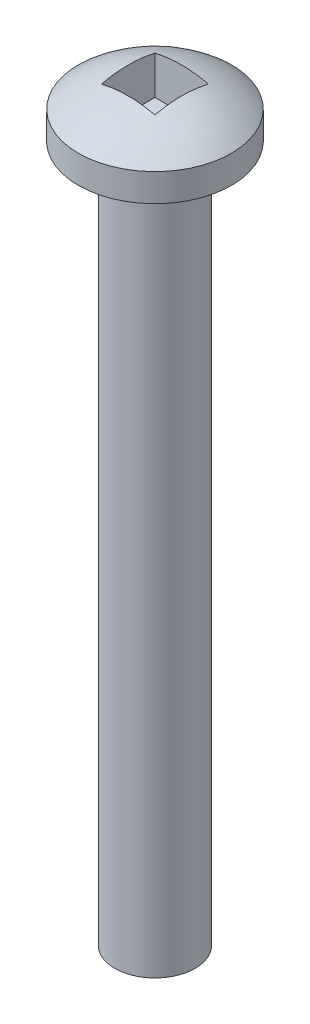
ISO-10303-21;
HEADER;
FILE_DESCRIPTION(('STEP AP214'),'2;1');
FILE_NAME('part.step','',(''),(''),'','','');
FILE_SCHEMA(('AUTOMOTIVE_DESIGN { 1 0 10303 214 1 1 1 1 }'));
ENDSEC;
DATA;
#1=APPLICATION_CONTEXT('core data for automotive mechanical design processes');
#2=APPLICATION_PROTOCOL_DEFINITION('international standard','automotive_design',2000,#1);
#3=PRODUCT_CONTEXT('',#1,'mechanical');
#4=PRODUCT('Part','Part','',(#3));
#5=PRODUCT_RELATED_PRODUCT_CATEGORY('part','',(#4));
#6=PRODUCT_DEFINITION_FORMATION('','',#4);
#7=PRODUCT_DEFINITION_CONTEXT('part definition',#1,'design');
#8=PRODUCT_DEFINITION('design','',#6,#7);
#9=PRODUCT_DEFINITION_SHAPE('','',#8);
#10=(LENGTH_UNIT() NAMED_UNIT(*) SI_UNIT(.MILLI.,.METRE.));
#11=(NAMED_UNIT(*) PLANE_ANGLE_UNIT() SI_UNIT($,.RADIAN.));
#12=(NAMED_UNIT(*) SI_UNIT($,.STERADIAN.) SOLID_ANGLE_UNIT());
#13=UNCERTAINTY_MEASURE_WITH_UNIT(LENGTH_MEASURE(1.E-05),#10,'distance_accuracy_value','');
#14=(GEOMETRIC_REPRESENTATION_CONTEXT(3) GLOBAL_UNCERTAINTY_ASSIGNED_CONTEXT((#13)) GLOBAL_UNIT_ASSIGNED_CONTEXT((#10,
#11,#12)) REPRESENTATION_CONTEXT('',''));
#15=CARTESIAN_POINT('',(0.,0.,0.));
#16=DIRECTION('',(0.,0.,1.));
#17=DIRECTION('',(1.,0.,0.));
#18=AXIS2_PLACEMENT_3D('',#15,#16,#17);
#19=CARTESIAN_POINT('',(0.,-31.75,0.));
#20=DIRECTION('',(0.,1.,0.));
#21=DIRECTION('',(0.,0.,1.));
#22=AXIS2_PLACEMENT_3D('',#19,#20,#21);
#23=CYLINDRICAL_SURFACE('',#22,1.8288);
#24=CARTESIAN_POINT('',(0.,-31.75,0.));
#25=DIRECTION('',(0.,1.,0.));
#26=DIRECTION('',(0.,0.,1.));
#27=AXIS2_PLACEMENT_3D('',#24,#25,#26);
#28=CIRCLE('',#27,1.8288);
#29=CARTESIAN_POINT('',(0.,-31.75,1.8288));
#30=VERTEX_POINT('',#29);
#31=EDGE_CURVE('E104',#30,#30,#28,.T.);
#32=ORIENTED_EDGE('',*,*,#31,.T.);
#33=EDGE_LOOP('',(#32));
#34=FACE_BOUND('',#33,.T.);
#35=CARTESIAN_POINT('',(0.,0.,0.));
#36=DIRECTION('',(0.,1.,0.));
#37=DIRECTION('',(0.,0.,1.));
#38=AXIS2_PLACEMENT_3D('',#35,#36,#37);
#39=CIRCLE('',#38,1.8288);
#40=CARTESIAN_POINT('',(0.,0.,1.8288));
#41=VERTEX_POINT('',#40);
#42=EDGE_CURVE('E108',#41,#41,#39,.T.);
#43=ORIENTED_EDGE('',*,*,#42,.F.);
#44=EDGE_LOOP('',(#43));
#45=FACE_BOUND('',#44,.T.);
#46=ADVANCED_FACE('F32',(#34,#45),#23,.T.);
#47=CARTESIAN_POINT('',(0.,-31.75,0.));
#48=DIRECTION('',(0.,1.,0.));
#49=DIRECTION('',(0.,0.,1.));
#50=AXIS2_PLACEMENT_3D('',#47,#48,#49);
#51=PLANE('',#50);
#52=ORIENTED_EDGE('',*,*,#31,.F.);
#53=EDGE_LOOP('',(#52));
#54=FACE_BOUND('',#53,.T.);
#55=ADVANCED_FACE('F128',(#54),#51,.F.);
#56=CARTESIAN_POINT('',(0.,1.27,0.));
#57=DIRECTION('',(0.,-1.,0.));
#58=DIRECTION('',(0.,0.,-1.));
#59=AXIS2_PLACEMENT_3D('',#56,#57,#58);
#60=CYLINDRICAL_SURFACE('',#59,3.4925);
#61=CARTESIAN_POINT('',(0.,1.27,0.));
#62=DIRECTION('',(0.,1.,0.));
#63=DIRECTION('',(0.,0.,1.));
#64=AXIS2_PLACEMENT_3D('',#61,#62,#63);
#65=CIRCLE('',#64,3.4925);
#66=CARTESIAN_POINT('',(0.,1.27,3.4925));
#67=VERTEX_POINT('',#66);
#68=EDGE_CURVE('E103',#67,#67,#65,.T.);
#69=ORIENTED_EDGE('',*,*,#68,.F.);
#70=EDGE_LOOP('',(#69));
#71=FACE_BOUND('',#70,.T.);
#72=CARTESIAN_POINT('',(0.,0.,0.));
#73=DIRECTION('',(0.,1.,0.));
#74=DIRECTION('',(0.,0.,1.));
#75=AXIS2_PLACEMENT_3D('',#72,#73,#74);
#76=CIRCLE('',#75,3.4925);
#77=CARTESIAN_POINT('',(0.,0.,3.4925));
#78=VERTEX_POINT('',#77);
#79=EDGE_CURVE('E97',#78,#78,#76,.T.);
#80=ORIENTED_EDGE('',*,*,#79,.T.);
#81=EDGE_LOOP('',(#80));
#82=FACE_BOUND('',#81,.T.);
#83=ADVANCED_FACE('F123',(#71,#82),#60,.T.);
#84=CARTESIAN_POINT('',(0.,-2.8971875,0.));
#85=DIRECTION('',(0.,0.,1.));
#86=DIRECTION('',(1.,0.,0.));
#87=AXIS2_PLACEMENT_3D('',#84,#85,#86);
#88=SPHERICAL_SURFACE('',#87,5.4371875);
#89=CARTESIAN_POINT('',(1.2192,-2.8971875,0.));
#90=DIRECTION('',(1.,0.,0.));
#91=DIRECTION('',(0.,0.,-1.));
#92=AXIS2_PLACEMENT_3D('',#89,#90,#91);
#93=CIRCLE('',#92,5.29873185490229);
#94=CARTESIAN_POINT('',(1.2192,2.25937246088053,1.2192));
#95=VERTEX_POINT('',#94);
#96=CARTESIAN_POINT('',(1.2192,2.25937246088053,-1.2192));
#97=VERTEX_POINT('',#96);
#98=EDGE_CURVE('E11',#95,#97,#93,.F.);
#99=ORIENTED_EDGE('',*,*,#98,.F.);
#100=CARTESIAN_POINT('',(0.,-2.8971875,1.2192));
#101=DIRECTION('',(0.,0.,1.));
#102=DIRECTION('',(1.,0.,0.));
#103=AXIS2_PLACEMENT_3D('',#100,#101,#102);
#104=CIRCLE('',#103,5.29873185490229);
#105=CARTESIAN_POINT('',(-1.2192,2.25937246088053,1.2192));
#106=VERTEX_POINT('',#105);
#107=EDGE_CURVE('E40',#106,#95,#104,.F.);
#108=ORIENTED_EDGE('',*,*,#107,.F.);
#109=CARTESIAN_POINT('',(-1.2192,-2.8971875,0.));
#110=DIRECTION('',(-1.,0.,0.));
#111=DIRECTION('',(0.,0.,1.));
#112=AXIS2_PLACEMENT_3D('',#109,#110,#111);
#113=CIRCLE('',#112,5.29873185490229);
#114=CARTESIAN_POINT('',(-1.2192,2.25937246088053,-1.2192));
#115=VERTEX_POINT('',#114);
#116=EDGE_CURVE('E114',#115,#106,#113,.F.);
#117=ORIENTED_EDGE('',*,*,#116,.F.);
#118=CARTESIAN_POINT('',(0.,-2.8971875,-1.2192));
#119=DIRECTION('',(0.,0.,-1.));
#120=DIRECTION('',(-1.,0.,0.));
#121=AXIS2_PLACEMENT_3D('',#118,#119,#120);
#122=CIRCLE('',#121,5.29873185490229);
#123=EDGE_CURVE('E107',#97,#115,#122,.F.);
#124=ORIENTED_EDGE('',*,*,#123,.F.);
#125=EDGE_LOOP('',(#99,#108,#117,#124));
#126=FACE_BOUND('',#125,.T.);
#127=ORIENTED_EDGE('',*,*,#68,.T.);
#128=EDGE_LOOP('',(#127));
#129=FACE_BOUND('',#128,.T.);
#130=ADVANCED_FACE('F34',(#126,#129),#88,.T.);
#131=CARTESIAN_POINT('',(0.,0.,0.));
#132=DIRECTION('',(0.,1.,0.));
#133=DIRECTION('',(0.,0.,1.));
#134=AXIS2_PLACEMENT_3D('',#131,#132,#133);
#135=PLANE('',#134);
#136=ORIENTED_EDGE('',*,*,#42,.T.);
#137=EDGE_LOOP('',(#136));
#138=FACE_BOUND('',#137,.T.);
#139=ORIENTED_EDGE('',*,*,#79,.F.);
#140=EDGE_LOOP('',(#139));
#141=FACE_BOUND('',#140,.T.);
#142=ADVANCED_FACE('F122',(#138,#141),#135,.F.);
#143=CARTESIAN_POINT('',(1.2192,0.508,1.2192));
#144=DIRECTION('',(1.,0.,0.));
#145=DIRECTION('',(0.,0.,-1.));
#146=AXIS2_PLACEMENT_3D('',#143,#144,#145);
#147=PLANE('',#146);
#148=ORIENTED_EDGE('',*,*,#98,.T.);
#149=DIRECTION('',(0.,1.,0.));
#150=VECTOR('',#149,1.);
#151=CARTESIAN_POINT('',(1.2192,0.508,-1.2192));
#152=LINE('',#151,#150);
#153=CARTESIAN_POINT('',(1.2192,0.508,-1.2192));
#154=VERTEX_POINT('',#153);
#155=EDGE_CURVE('E47',#154,#97,#152,.T.);
#156=ORIENTED_EDGE('',*,*,#155,.F.);
#157=DIRECTION('',(0.,0.,-1.));
#158=VECTOR('',#157,1.);
#159=CARTESIAN_POINT('',(1.2192,0.508,1.2192));
#160=LINE('',#159,#158);
#161=CARTESIAN_POINT('',(1.2192,0.508,1.2192));
#162=VERTEX_POINT('',#161);
#163=EDGE_CURVE('E73',#162,#154,#160,.T.);
#164=ORIENTED_EDGE('',*,*,#163,.F.);
#165=DIRECTION('',(0.,1.,0.));
#166=VECTOR('',#165,1.);
#167=CARTESIAN_POINT('',(1.2192,0.508,1.2192));
#168=LINE('',#167,#166);
#169=EDGE_CURVE('E95',#162,#95,#168,.T.);
#170=ORIENTED_EDGE('',*,*,#169,.T.);
#171=EDGE_LOOP('',(#148,#156,#164,#170));
#172=FACE_BOUND('',#171,.T.);
#173=ADVANCED_FACE('F71',(#172),#147,.F.);
#174=CARTESIAN_POINT('',(-1.2192,0.508,1.2192));
#175=DIRECTION('',(0.,0.,1.));
#176=DIRECTION('',(1.,0.,0.));
#177=AXIS2_PLACEMENT_3D('',#174,#175,#176);
#178=PLANE('',#177);
#179=ORIENTED_EDGE('',*,*,#107,.T.);
#180=ORIENTED_EDGE('',*,*,#169,.F.);
#181=DIRECTION('',(1.,0.,0.));
#182=VECTOR('',#181,1.);
#183=CARTESIAN_POINT('',(-1.2192,0.508,1.2192));
#184=LINE('',#183,#182);
#185=CARTESIAN_POINT('',(-1.2192,0.508,1.2192));
#186=VERTEX_POINT('',#185);
#187=EDGE_CURVE('E78',#186,#162,#184,.T.);
#188=ORIENTED_EDGE('',*,*,#187,.F.);
#189=DIRECTION('',(0.,1.,0.));
#190=VECTOR('',#189,1.);
#191=CARTESIAN_POINT('',(-1.2192,0.508,1.2192));
#192=LINE('',#191,#190);
#193=EDGE_CURVE('E98',#186,#106,#192,.T.);
#194=ORIENTED_EDGE('',*,*,#193,.T.);
#195=EDGE_LOOP('',(#179,#180,#188,#194));
#196=FACE_BOUND('',#195,.T.);
#197=ADVANCED_FACE('F119',(#196),#178,.F.);
#198=CARTESIAN_POINT('',(-1.2192,0.508,1.2192));
#199=DIRECTION('',(-1.,0.,0.));
#200=DIRECTION('',(0.,0.,1.));
#201=AXIS2_PLACEMENT_3D('',#198,#199,#200);
#202=PLANE('',#201);
#203=ORIENTED_EDGE('',*,*,#116,.T.);
#204=ORIENTED_EDGE('',*,*,#193,.F.);
#205=DIRECTION('',(0.,0.,1.));
#206=VECTOR('',#205,1.);
#207=CARTESIAN_POINT('',(-1.2192,0.508,1.2192));
#208=LINE('',#207,#206);
#209=CARTESIAN_POINT('',(-1.2192,0.508,-1.2192));
#210=VERTEX_POINT('',#209);
#211=EDGE_CURVE('E87',#210,#186,#208,.T.);
#212=ORIENTED_EDGE('',*,*,#211,.F.);
#213=DIRECTION('',(0.,1.,0.));
#214=VECTOR('',#213,1.);
#215=CARTESIAN_POINT('',(-1.2192,0.508,-1.2192));
#216=LINE('',#215,#214);
#217=EDGE_CURVE('E77',#210,#115,#216,.T.);
#218=ORIENTED_EDGE('',*,*,#217,.T.);
#219=EDGE_LOOP('',(#203,#204,#212,#218));
#220=FACE_BOUND('',#219,.T.);
#221=ADVANCED_FACE('F117',(#220),#202,.F.);
#222=CARTESIAN_POINT('',(-1.2192,0.508,-1.2192));
#223=DIRECTION('',(0.,0.,-1.));
#224=DIRECTION('',(-1.,0.,0.));
#225=AXIS2_PLACEMENT_3D('',#222,#223,#224);
#226=PLANE('',#225);
#227=ORIENTED_EDGE('',*,*,#123,.T.);
#228=ORIENTED_EDGE('',*,*,#217,.F.);
#229=DIRECTION('',(-1.,0.,0.));
#230=VECTOR('',#229,1.);
#231=CARTESIAN_POINT('',(-1.2192,0.508,-1.2192));
#232=LINE('',#231,#230);
#233=EDGE_CURVE('E81',#154,#210,#232,.T.);
#234=ORIENTED_EDGE('',*,*,#233,.F.);
#235=ORIENTED_EDGE('',*,*,#155,.T.);
#236=EDGE_LOOP('',(#227,#228,#234,#235));
#237=FACE_BOUND('',#236,.T.);
#238=ADVANCED_FACE('F82',(#237),#226,.F.);
#239=CARTESIAN_POINT('',(0.,0.508,0.));
#240=DIRECTION('',(0.,-1.,0.));
#241=DIRECTION('',(0.,0.,-1.));
#242=AXIS2_PLACEMENT_3D('',#239,#240,#241);
#243=PLANE('',#242);
#244=ORIENTED_EDGE('',*,*,#163,.T.);
#245=ORIENTED_EDGE('',*,*,#233,.T.);
#246=ORIENTED_EDGE('',*,*,#211,.T.);
#247=ORIENTED_EDGE('',*,*,#187,.T.);
#248=EDGE_LOOP('',(#244,#245,#246,#247));
#249=FACE_BOUND('',#248,.T.);
#250=ADVANCED_FACE('F89',(#249),#243,.F.);
#251=CLOSED_SHELL('',(#46,#55,#83,#130,#142,#173,#197,#221,#238,#250));
#252=MANIFOLD_SOLID_BREP('B2',#251);
#253=ADVANCED_BREP_SHAPE_REPRESENTATION('',(#18,#252),#14);
#254=SHAPE_DEFINITION_REPRESENTATION(#9,#253);
ENDSEC;
END-ISO-10303-21;
